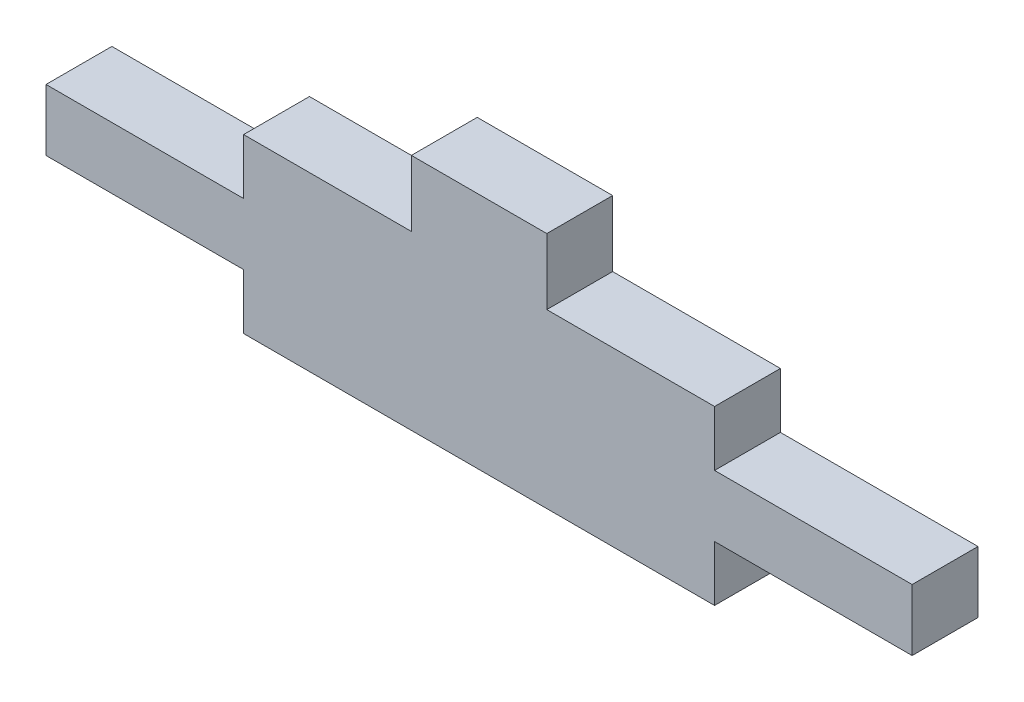
ISO-10303-21;
HEADER;
FILE_DESCRIPTION(('STEP AP214'),'2;1');
FILE_NAME('part.step','',(''),(''),'','','');
FILE_SCHEMA(('AUTOMOTIVE_DESIGN { 1 0 10303 214 1 1 1 1 }'));
ENDSEC;
DATA;
#1=APPLICATION_CONTEXT('core data for automotive mechanical design processes');
#2=APPLICATION_PROTOCOL_DEFINITION('international standard','automotive_design',2000,#1);
#3=PRODUCT_CONTEXT('',#1,'mechanical');
#4=PRODUCT('Part','Part','',(#3));
#5=PRODUCT_RELATED_PRODUCT_CATEGORY('part','',(#4));
#6=PRODUCT_DEFINITION_FORMATION('','',#4);
#7=PRODUCT_DEFINITION_CONTEXT('part definition',#1,'design');
#8=PRODUCT_DEFINITION('design','',#6,#7);
#9=PRODUCT_DEFINITION_SHAPE('','',#8);
#10=(LENGTH_UNIT() NAMED_UNIT(*) SI_UNIT(.MILLI.,.METRE.));
#11=(NAMED_UNIT(*) PLANE_ANGLE_UNIT() SI_UNIT($,.RADIAN.));
#12=(NAMED_UNIT(*) SI_UNIT($,.STERADIAN.) SOLID_ANGLE_UNIT());
#13=UNCERTAINTY_MEASURE_WITH_UNIT(LENGTH_MEASURE(1.E-05),#10,'distance_accuracy_value','');
#14=(GEOMETRIC_REPRESENTATION_CONTEXT(3) GLOBAL_UNCERTAINTY_ASSIGNED_CONTEXT((#13)) GLOBAL_UNIT_ASSIGNED_CONTEXT((#10,
#11,#12)) REPRESENTATION_CONTEXT('',''));
#15=CARTESIAN_POINT('',(0.,0.,0.));
#16=DIRECTION('',(0.,0.,1.));
#17=DIRECTION('',(1.,0.,0.));
#18=AXIS2_PLACEMENT_3D('',#15,#16,#17);
#19=CARTESIAN_POINT('',(40.6800004420004,19.3499997259001,5.35));
#20=DIRECTION('',(0.,-1.,0.));
#21=DIRECTION('',(0.,0.,-1.));
#22=AXIS2_PLACEMENT_3D('',#19,#20,#21);
#23=PLANE('',#22);
#24=DIRECTION('',(-1.,0.,0.));
#25=VECTOR('',#24,1.);
#26=CARTESIAN_POINT('',(40.6800004420004,19.3499997259001,0.));
#27=LINE('',#26,#25);
#28=CARTESIAN_POINT('',(40.6800004420004,19.3499997259001,0.));
#29=VERTEX_POINT('',#28);
#30=CARTESIAN_POINT('',(29.6800006181003,19.3499997259001,0.));
#31=VERTEX_POINT('',#30);
#32=EDGE_CURVE('E177',#29,#31,#27,.T.);
#33=ORIENTED_EDGE('',*,*,#32,.T.);
#34=DIRECTION('',(0.,0.,-1.));
#35=VECTOR('',#34,1.);
#36=CARTESIAN_POINT('',(29.6800006181003,19.3499997259001,5.35));
#37=LINE('',#36,#35);
#38=CARTESIAN_POINT('',(29.6800006181003,19.3499997259001,5.35));
#39=VERTEX_POINT('',#38);
#40=EDGE_CURVE('E11',#39,#31,#37,.T.);
#41=ORIENTED_EDGE('',*,*,#40,.F.);
#42=DIRECTION('',(-1.,0.,0.));
#43=VECTOR('',#42,1.);
#44=CARTESIAN_POINT('',(40.6800004420004,19.3499997259001,5.35));
#45=LINE('',#44,#43);
#46=CARTESIAN_POINT('',(40.6800004420004,19.3499997259001,5.35));
#47=VERTEX_POINT('',#46);
#48=EDGE_CURVE('E207',#47,#39,#45,.T.);
#49=ORIENTED_EDGE('',*,*,#48,.F.);
#50=DIRECTION('',(0.,0.,-1.));
#51=VECTOR('',#50,1.);
#52=CARTESIAN_POINT('',(40.6800004420004,19.3499997259001,5.35));
#53=LINE('',#52,#51);
#54=EDGE_CURVE('E173',#47,#29,#53,.T.);
#55=ORIENTED_EDGE('',*,*,#54,.T.);
#56=EDGE_LOOP('',(#33,#41,#49,#55));
#57=FACE_BOUND('',#56,.T.);
#58=ADVANCED_FACE('F33',(#57),#23,.F.);
#59=CARTESIAN_POINT('',(29.6800006181003,19.3499997259001,5.35));
#60=DIRECTION('',(1.,0.,0.));
#61=DIRECTION('',(0.,0.,-1.));
#62=AXIS2_PLACEMENT_3D('',#59,#60,#61);
#63=PLANE('',#62);
#64=DIRECTION('',(0.,-1.,0.));
#65=VECTOR('',#64,1.);
#66=CARTESIAN_POINT('',(29.6800006181003,19.3499997259001,0.));
#67=LINE('',#66,#65);
#68=CARTESIAN_POINT('',(29.6800006181003,14.0000004321996,0.));
#69=VERTEX_POINT('',#68);
#70=EDGE_CURVE('E180',#31,#69,#67,.T.);
#71=ORIENTED_EDGE('',*,*,#70,.T.);
#72=DIRECTION('',(0.,0.,-1.));
#73=VECTOR('',#72,1.);
#74=CARTESIAN_POINT('',(29.6800006181003,14.0000004321996,5.35));
#75=LINE('',#74,#73);
#76=CARTESIAN_POINT('',(29.6800006181003,14.0000004321996,5.35));
#77=VERTEX_POINT('',#76);
#78=EDGE_CURVE('E41',#77,#69,#75,.T.);
#79=ORIENTED_EDGE('',*,*,#78,.F.);
#80=DIRECTION('',(0.,-1.,0.));
#81=VECTOR('',#80,1.);
#82=CARTESIAN_POINT('',(29.6800006181003,19.3499997259001,5.35));
#83=LINE('',#82,#81);
#84=EDGE_CURVE('E116',#39,#77,#83,.T.);
#85=ORIENTED_EDGE('',*,*,#84,.F.);
#86=ORIENTED_EDGE('',*,*,#40,.T.);
#87=EDGE_LOOP('',(#71,#79,#85,#86));
#88=FACE_BOUND('',#87,.T.);
#89=ADVANCED_FACE('F305',(#88),#63,.F.);
#90=CARTESIAN_POINT('',(29.6800006181003,14.0000004321996,5.35));
#91=DIRECTION('',(0.,-1.,0.));
#92=DIRECTION('',(0.,0.,-1.));
#93=AXIS2_PLACEMENT_3D('',#90,#91,#92);
#94=PLANE('',#93);
#95=DIRECTION('',(-1.,0.,0.));
#96=VECTOR('',#95,1.);
#97=CARTESIAN_POINT('',(29.6800006181003,14.0000004321996,0.));
#98=LINE('',#97,#96);
#99=CARTESIAN_POINT('',(16.0499997437003,14.0000004321996,0.));
#100=VERTEX_POINT('',#99);
#101=EDGE_CURVE('E182',#69,#100,#98,.T.);
#102=ORIENTED_EDGE('',*,*,#101,.T.);
#103=DIRECTION('',(0.,0.,-1.));
#104=VECTOR('',#103,1.);
#105=CARTESIAN_POINT('',(16.0499997437003,14.0000004321996,5.35));
#106=LINE('',#105,#104);
#107=CARTESIAN_POINT('',(16.0499997437003,14.0000004321996,5.35));
#108=VERTEX_POINT('',#107);
#109=EDGE_CURVE('E238',#108,#100,#106,.T.);
#110=ORIENTED_EDGE('',*,*,#109,.F.);
#111=DIRECTION('',(-1.,0.,0.));
#112=VECTOR('',#111,1.);
#113=CARTESIAN_POINT('',(29.6800006181003,14.0000004321996,5.35));
#114=LINE('',#113,#112);
#115=EDGE_CURVE('E246',#77,#108,#114,.T.);
#116=ORIENTED_EDGE('',*,*,#115,.F.);
#117=ORIENTED_EDGE('',*,*,#78,.T.);
#118=EDGE_LOOP('',(#102,#110,#116,#117));
#119=FACE_BOUND('',#118,.T.);
#120=ADVANCED_FACE('F244',(#119),#94,.F.);
#121=CARTESIAN_POINT('',(16.0499997437003,14.0000004321996,5.35));
#122=DIRECTION('',(1.,0.,0.));
#123=DIRECTION('',(0.,0.,-1.));
#124=AXIS2_PLACEMENT_3D('',#121,#122,#123);
#125=PLANE('',#124);
#126=DIRECTION('',(0.,-1.,0.));
#127=VECTOR('',#126,1.);
#128=CARTESIAN_POINT('',(16.0499997437003,14.0000004321996,0.));
#129=LINE('',#128,#127);
#130=CARTESIAN_POINT('',(16.0499997437003,9.49999969459994,0.));
#131=VERTEX_POINT('',#130);
#132=EDGE_CURVE('E184',#100,#131,#129,.T.);
#133=ORIENTED_EDGE('',*,*,#132,.T.);
#134=DIRECTION('',(0.,0.,-1.));
#135=VECTOR('',#134,1.);
#136=CARTESIAN_POINT('',(16.0499997437003,9.49999969459994,5.35));
#137=LINE('',#136,#135);
#138=CARTESIAN_POINT('',(16.0499997437003,9.49999969459994,5.35));
#139=VERTEX_POINT('',#138);
#140=EDGE_CURVE('E235',#139,#131,#137,.T.);
#141=ORIENTED_EDGE('',*,*,#140,.F.);
#142=DIRECTION('',(0.,-1.,0.));
#143=VECTOR('',#142,1.);
#144=CARTESIAN_POINT('',(16.0499997437003,14.0000004321996,5.35));
#145=LINE('',#144,#143);
#146=EDGE_CURVE('E264',#108,#139,#145,.T.);
#147=ORIENTED_EDGE('',*,*,#146,.F.);
#148=ORIENTED_EDGE('',*,*,#109,.T.);
#149=EDGE_LOOP('',(#133,#141,#147,#148));
#150=FACE_BOUND('',#149,.T.);
#151=ADVANCED_FACE('F255',(#150),#125,.F.);
#152=CARTESIAN_POINT('',(16.0499997437003,9.49999969459994,5.35));
#153=DIRECTION('',(0.,-1.,0.));
#154=DIRECTION('',(0.,0.,-1.));
#155=AXIS2_PLACEMENT_3D('',#152,#153,#154);
#156=PLANE('',#155);
#157=DIRECTION('',(-1.,0.,0.));
#158=VECTOR('',#157,1.);
#159=CARTESIAN_POINT('',(16.0499997437003,9.49999969459994,0.));
#160=LINE('',#159,#158);
#161=CARTESIAN_POINT('',(0.,9.49999969459994,0.));
#162=VERTEX_POINT('',#161);
#163=EDGE_CURVE('E186',#131,#162,#160,.T.);
#164=ORIENTED_EDGE('',*,*,#163,.T.);
#165=DIRECTION('',(0.,0.,-1.));
#166=VECTOR('',#165,1.);
#167=CARTESIAN_POINT('',(0.,9.49999969459994,5.35));
#168=LINE('',#167,#166);
#169=CARTESIAN_POINT('',(0.,9.49999969459994,5.35));
#170=VERTEX_POINT('',#169);
#171=EDGE_CURVE('E232',#170,#162,#168,.T.);
#172=ORIENTED_EDGE('',*,*,#171,.F.);
#173=DIRECTION('',(-1.,0.,0.));
#174=VECTOR('',#173,1.);
#175=CARTESIAN_POINT('',(16.0499997437003,9.49999969459994,5.35));
#176=LINE('',#175,#174);
#177=EDGE_CURVE('E261',#139,#170,#176,.T.);
#178=ORIENTED_EDGE('',*,*,#177,.F.);
#179=ORIENTED_EDGE('',*,*,#140,.T.);
#180=EDGE_LOOP('',(#164,#172,#178,#179));
#181=FACE_BOUND('',#180,.T.);
#182=ADVANCED_FACE('F259',(#181),#156,.F.);
#183=CARTESIAN_POINT('',(0.,9.49999969459994,5.35));
#184=DIRECTION('',(1.,0.,0.));
#185=DIRECTION('',(0.,0.,-1.));
#186=AXIS2_PLACEMENT_3D('',#183,#184,#185);
#187=PLANE('',#186);
#188=DIRECTION('',(0.,-1.,0.));
#189=VECTOR('',#188,1.);
#190=CARTESIAN_POINT('',(0.,9.49999969459994,0.));
#191=LINE('',#190,#189);
#192=CARTESIAN_POINT('',(0.,4.49999980629984,0.));
#193=VERTEX_POINT('',#192);
#194=EDGE_CURVE('E188',#162,#193,#191,.T.);
#195=ORIENTED_EDGE('',*,*,#194,.T.);
#196=DIRECTION('',(0.,0.,-1.));
#197=VECTOR('',#196,1.);
#198=CARTESIAN_POINT('',(0.,4.49999980629984,5.35));
#199=LINE('',#198,#197);
#200=CARTESIAN_POINT('',(0.,4.49999980629984,5.35));
#201=VERTEX_POINT('',#200);
#202=EDGE_CURVE('E229',#201,#193,#199,.T.);
#203=ORIENTED_EDGE('',*,*,#202,.F.);
#204=DIRECTION('',(0.,-1.,0.));
#205=VECTOR('',#204,1.);
#206=CARTESIAN_POINT('',(0.,9.49999969459994,5.35));
#207=LINE('',#206,#205);
#208=EDGE_CURVE('E263',#170,#201,#207,.T.);
#209=ORIENTED_EDGE('',*,*,#208,.F.);
#210=ORIENTED_EDGE('',*,*,#171,.T.);
#211=EDGE_LOOP('',(#195,#203,#209,#210));
#212=FACE_BOUND('',#211,.T.);
#213=ADVANCED_FACE('F318',(#212),#187,.F.);
#214=CARTESIAN_POINT('',(0.,4.49999980629984,5.35));
#215=DIRECTION('',(0.,1.,0.));
#216=DIRECTION('',(0.,0.,1.));
#217=AXIS2_PLACEMENT_3D('',#214,#215,#216);
#218=PLANE('',#217);
#219=DIRECTION('',(1.,0.,0.));
#220=VECTOR('',#219,1.);
#221=CARTESIAN_POINT('',(0.,4.49999980629984,0.));
#222=LINE('',#221,#220);
#223=CARTESIAN_POINT('',(16.0499997437,4.49999980629984,0.));
#224=VERTEX_POINT('',#223);
#225=EDGE_CURVE('E190',#193,#224,#222,.T.);
#226=ORIENTED_EDGE('',*,*,#225,.T.);
#227=DIRECTION('',(0.,0.,-1.));
#228=VECTOR('',#227,1.);
#229=CARTESIAN_POINT('',(16.0499997437,4.49999980629984,5.35));
#230=LINE('',#229,#228);
#231=CARTESIAN_POINT('',(16.0499997437,4.49999980629984,5.35));
#232=VERTEX_POINT('',#231);
#233=EDGE_CURVE('E226',#232,#224,#230,.T.);
#234=ORIENTED_EDGE('',*,*,#233,.F.);
#235=DIRECTION('',(1.,0.,0.));
#236=VECTOR('',#235,1.);
#237=CARTESIAN_POINT('',(0.,4.49999980629984,5.35));
#238=LINE('',#237,#236);
#239=EDGE_CURVE('E266',#201,#232,#238,.T.);
#240=ORIENTED_EDGE('',*,*,#239,.F.);
#241=ORIENTED_EDGE('',*,*,#202,.T.);
#242=EDGE_LOOP('',(#226,#234,#240,#241));
#243=FACE_BOUND('',#242,.T.);
#244=ADVANCED_FACE('F321',(#243),#218,.F.);
#245=CARTESIAN_POINT('',(16.0499997437,4.49999980629984,5.35));
#246=DIRECTION('',(1.,0.,0.));
#247=DIRECTION('',(0.,0.,-1.));
#248=AXIS2_PLACEMENT_3D('',#245,#246,#247);
#249=PLANE('',#248);
#250=DIRECTION('',(0.,-1.,0.));
#251=VECTOR('',#250,1.);
#252=CARTESIAN_POINT('',(16.0499997437,4.49999980629984,0.));
#253=LINE('',#252,#251);
#254=CARTESIAN_POINT('',(16.0499997437,0.,0.));
#255=VERTEX_POINT('',#254);
#256=EDGE_CURVE('E192',#224,#255,#253,.T.);
#257=ORIENTED_EDGE('',*,*,#256,.T.);
#258=DIRECTION('',(0.,0.,-1.));
#259=VECTOR('',#258,1.);
#260=CARTESIAN_POINT('',(16.0499997437,0.,5.35));
#261=LINE('',#260,#259);
#262=CARTESIAN_POINT('',(16.0499997437,0.,5.35));
#263=VERTEX_POINT('',#262);
#264=EDGE_CURVE('E223',#263,#255,#261,.T.);
#265=ORIENTED_EDGE('',*,*,#264,.F.);
#266=DIRECTION('',(0.,-1.,0.));
#267=VECTOR('',#266,1.);
#268=CARTESIAN_POINT('',(16.0499997437,4.49999980629984,5.35));
#269=LINE('',#268,#267);
#270=EDGE_CURVE('E272',#232,#263,#269,.T.);
#271=ORIENTED_EDGE('',*,*,#270,.F.);
#272=ORIENTED_EDGE('',*,*,#233,.T.);
#273=EDGE_LOOP('',(#257,#265,#271,#272));
#274=FACE_BOUND('',#273,.T.);
#275=ADVANCED_FACE('F325',(#274),#249,.F.);
#276=CARTESIAN_POINT('',(16.0499997437,0.,5.35));
#277=DIRECTION('',(0.,1.,0.));
#278=DIRECTION('',(0.,0.,1.));
#279=AXIS2_PLACEMENT_3D('',#276,#277,#278);
#280=PLANE('',#279);
#281=DIRECTION('',(1.,0.,0.));
#282=VECTOR('',#281,1.);
#283=CARTESIAN_POINT('',(16.0499997437,0.,0.));
#284=LINE('',#283,#282);
#285=CARTESIAN_POINT('',(54.3100005015004,0.,0.));
#286=VERTEX_POINT('',#285);
#287=EDGE_CURVE('E194',#255,#286,#284,.T.);
#288=ORIENTED_EDGE('',*,*,#287,.T.);
#289=DIRECTION('',(0.,0.,-1.));
#290=VECTOR('',#289,1.);
#291=CARTESIAN_POINT('',(54.3100005015004,0.,5.35));
#292=LINE('',#291,#290);
#293=CARTESIAN_POINT('',(54.3100005015004,0.,5.35));
#294=VERTEX_POINT('',#293);
#295=EDGE_CURVE('E220',#294,#286,#292,.T.);
#296=ORIENTED_EDGE('',*,*,#295,.F.);
#297=DIRECTION('',(1.,0.,0.));
#298=VECTOR('',#297,1.);
#299=CARTESIAN_POINT('',(16.0499997437,0.,5.35));
#300=LINE('',#299,#298);
#301=EDGE_CURVE('E274',#263,#294,#300,.T.);
#302=ORIENTED_EDGE('',*,*,#301,.F.);
#303=ORIENTED_EDGE('',*,*,#264,.T.);
#304=EDGE_LOOP('',(#288,#296,#302,#303));
#305=FACE_BOUND('',#304,.T.);
#306=ADVANCED_FACE('F329',(#305),#280,.F.);
#307=CARTESIAN_POINT('',(54.3100005015004,0.,5.35));
#308=DIRECTION('',(-1.,0.,0.));
#309=DIRECTION('',(0.,0.,1.));
#310=AXIS2_PLACEMENT_3D('',#307,#308,#309);
#311=PLANE('',#310);
#312=DIRECTION('',(0.,1.,0.));
#313=VECTOR('',#312,1.);
#314=CARTESIAN_POINT('',(54.3100005015004,0.,0.));
#315=LINE('',#314,#313);
#316=CARTESIAN_POINT('',(54.3100005015004,4.49999980630031,0.));
#317=VERTEX_POINT('',#316);
#318=EDGE_CURVE('E196',#286,#317,#315,.T.);
#319=ORIENTED_EDGE('',*,*,#318,.T.);
#320=DIRECTION('',(0.,0.,-1.));
#321=VECTOR('',#320,1.);
#322=CARTESIAN_POINT('',(54.3100005015004,4.49999980630031,5.35));
#323=LINE('',#322,#321);
#324=CARTESIAN_POINT('',(54.3100005015004,4.49999980630031,5.35));
#325=VERTEX_POINT('',#324);
#326=EDGE_CURVE('E217',#325,#317,#323,.T.);
#327=ORIENTED_EDGE('',*,*,#326,.F.);
#328=DIRECTION('',(0.,1.,0.));
#329=VECTOR('',#328,1.);
#330=CARTESIAN_POINT('',(54.3100005015004,0.,5.35));
#331=LINE('',#330,#329);
#332=EDGE_CURVE('E276',#294,#325,#331,.T.);
#333=ORIENTED_EDGE('',*,*,#332,.F.);
#334=ORIENTED_EDGE('',*,*,#295,.T.);
#335=EDGE_LOOP('',(#319,#327,#333,#334));
#336=FACE_BOUND('',#335,.T.);
#337=ADVANCED_FACE('F333',(#336),#311,.F.);
#338=CARTESIAN_POINT('',(54.3100005015004,4.49999980630031,5.35));
#339=DIRECTION('',(0.,1.,0.));
#340=DIRECTION('',(0.,0.,1.));
#341=AXIS2_PLACEMENT_3D('',#338,#339,#340);
#342=PLANE('',#341);
#343=DIRECTION('',(1.,0.,0.));
#344=VECTOR('',#343,1.);
#345=CARTESIAN_POINT('',(54.3100005015004,4.49999980630031,0.));
#346=LINE('',#345,#344);
#347=CARTESIAN_POINT('',(70.3600011765999,4.49999980630031,0.));
#348=VERTEX_POINT('',#347);
#349=EDGE_CURVE('E198',#317,#348,#346,.T.);
#350=ORIENTED_EDGE('',*,*,#349,.T.);
#351=DIRECTION('',(0.,0.,-1.));
#352=VECTOR('',#351,1.);
#353=CARTESIAN_POINT('',(70.3600011765999,4.49999980630031,5.35));
#354=LINE('',#353,#352);
#355=CARTESIAN_POINT('',(70.3600011765999,4.49999980630031,5.35));
#356=VERTEX_POINT('',#355);
#357=EDGE_CURVE('E214',#356,#348,#354,.T.);
#358=ORIENTED_EDGE('',*,*,#357,.F.);
#359=DIRECTION('',(1.,0.,0.));
#360=VECTOR('',#359,1.);
#361=CARTESIAN_POINT('',(54.3100005015004,4.49999980630031,5.35));
#362=LINE('',#361,#360);
#363=EDGE_CURVE('E278',#325,#356,#362,.T.);
#364=ORIENTED_EDGE('',*,*,#363,.F.);
#365=ORIENTED_EDGE('',*,*,#326,.T.);
#366=EDGE_LOOP('',(#350,#358,#364,#365));
#367=FACE_BOUND('',#366,.T.);
#368=ADVANCED_FACE('F337',(#367),#342,.F.);
#369=CARTESIAN_POINT('',(70.3600011765999,4.49999980630031,5.35));
#370=DIRECTION('',(-1.,0.,0.));
#371=DIRECTION('',(0.,0.,1.));
#372=AXIS2_PLACEMENT_3D('',#369,#370,#371);
#373=PLANE('',#372);
#374=DIRECTION('',(0.,1.,0.));
#375=VECTOR('',#374,1.);
#376=CARTESIAN_POINT('',(70.3600011765999,4.49999980630031,0.));
#377=LINE('',#376,#375);
#378=CARTESIAN_POINT('',(70.3600011765999,9.49999969460044,0.));
#379=VERTEX_POINT('',#378);
#380=EDGE_CURVE('E200',#348,#379,#377,.T.);
#381=ORIENTED_EDGE('',*,*,#380,.T.);
#382=DIRECTION('',(0.,0.,-1.));
#383=VECTOR('',#382,1.);
#384=CARTESIAN_POINT('',(70.3600011765999,9.49999969460044,5.35));
#385=LINE('',#384,#383);
#386=CARTESIAN_POINT('',(70.3600011765999,9.49999969460044,5.35));
#387=VERTEX_POINT('',#386);
#388=EDGE_CURVE('E211',#387,#379,#385,.T.);
#389=ORIENTED_EDGE('',*,*,#388,.F.);
#390=DIRECTION('',(0.,1.,0.));
#391=VECTOR('',#390,1.);
#392=CARTESIAN_POINT('',(70.3600011765999,4.49999980630031,5.35));
#393=LINE('',#392,#391);
#394=EDGE_CURVE('E280',#356,#387,#393,.T.);
#395=ORIENTED_EDGE('',*,*,#394,.F.);
#396=ORIENTED_EDGE('',*,*,#357,.T.);
#397=EDGE_LOOP('',(#381,#389,#395,#396));
#398=FACE_BOUND('',#397,.T.);
#399=ADVANCED_FACE('F286',(#398),#373,.F.);
#400=CARTESIAN_POINT('',(70.3600011765999,9.49999969460044,5.35));
#401=DIRECTION('',(0.,-1.,0.));
#402=DIRECTION('',(0.,0.,-1.));
#403=AXIS2_PLACEMENT_3D('',#400,#401,#402);
#404=PLANE('',#403);
#405=DIRECTION('',(-1.,0.,0.));
#406=VECTOR('',#405,1.);
#407=CARTESIAN_POINT('',(70.3600011765999,9.49999969460044,0.));
#408=LINE('',#407,#406);
#409=CARTESIAN_POINT('',(54.3100005014999,9.49999969460044,0.));
#410=VERTEX_POINT('',#409);
#411=EDGE_CURVE('E202',#379,#410,#408,.T.);
#412=ORIENTED_EDGE('',*,*,#411,.T.);
#413=DIRECTION('',(0.,0.,-1.));
#414=VECTOR('',#413,1.);
#415=CARTESIAN_POINT('',(54.3100005014999,9.49999969460044,5.35));
#416=LINE('',#415,#414);
#417=CARTESIAN_POINT('',(54.3100005014999,9.49999969460044,5.35));
#418=VERTEX_POINT('',#417);
#419=EDGE_CURVE('E168',#418,#410,#416,.T.);
#420=ORIENTED_EDGE('',*,*,#419,.F.);
#421=DIRECTION('',(-1.,0.,0.));
#422=VECTOR('',#421,1.);
#423=CARTESIAN_POINT('',(70.3600011765999,9.49999969460044,5.35));
#424=LINE('',#423,#422);
#425=EDGE_CURVE('E159',#387,#418,#424,.T.);
#426=ORIENTED_EDGE('',*,*,#425,.F.);
#427=ORIENTED_EDGE('',*,*,#388,.T.);
#428=EDGE_LOOP('',(#412,#420,#426,#427));
#429=FACE_BOUND('',#428,.T.);
#430=ADVANCED_FACE('F290',(#429),#404,.F.);
#431=CARTESIAN_POINT('',(54.3100005014999,9.49999969460044,5.35));
#432=DIRECTION('',(-1.,0.,0.));
#433=DIRECTION('',(0.,0.,1.));
#434=AXIS2_PLACEMENT_3D('',#431,#432,#433);
#435=PLANE('',#434);
#436=DIRECTION('',(0.,1.,0.));
#437=VECTOR('',#436,1.);
#438=CARTESIAN_POINT('',(54.3100005014999,9.49999969460044,0.));
#439=LINE('',#438,#437);
#440=CARTESIAN_POINT('',(54.3100005014999,14.0000004322004,0.));
#441=VERTEX_POINT('',#440);
#442=EDGE_CURVE('E167',#410,#441,#439,.T.);
#443=ORIENTED_EDGE('',*,*,#442,.T.);
#444=DIRECTION('',(0.,0.,-1.));
#445=VECTOR('',#444,1.);
#446=CARTESIAN_POINT('',(54.3100005014999,14.0000004322004,5.35));
#447=LINE('',#446,#445);
#448=CARTESIAN_POINT('',(54.3100005014999,14.0000004322004,5.35));
#449=VERTEX_POINT('',#448);
#450=EDGE_CURVE('E164',#449,#441,#447,.T.);
#451=ORIENTED_EDGE('',*,*,#450,.F.);
#452=DIRECTION('',(0.,1.,0.));
#453=VECTOR('',#452,1.);
#454=CARTESIAN_POINT('',(54.3100005014999,9.49999969460044,5.35));
#455=LINE('',#454,#453);
#456=EDGE_CURVE('E153',#418,#449,#455,.T.);
#457=ORIENTED_EDGE('',*,*,#456,.F.);
#458=ORIENTED_EDGE('',*,*,#419,.T.);
#459=EDGE_LOOP('',(#443,#451,#457,#458));
#460=FACE_BOUND('',#459,.T.);
#461=ADVANCED_FACE('F165',(#460),#435,.F.);
#462=CARTESIAN_POINT('',(54.3100005014999,14.0000004322004,5.35));
#463=DIRECTION('',(0.,-1.,0.));
#464=DIRECTION('',(0.,0.,-1.));
#465=AXIS2_PLACEMENT_3D('',#462,#463,#464);
#466=PLANE('',#465);
#467=DIRECTION('',(-1.,0.,0.));
#468=VECTOR('',#467,1.);
#469=CARTESIAN_POINT('',(54.3100005014999,14.0000004322004,0.));
#470=LINE('',#469,#468);
#471=CARTESIAN_POINT('',(40.6800004420004,14.0000004322004,0.));
#472=VERTEX_POINT('',#471);
#473=EDGE_CURVE('E102',#441,#472,#470,.T.);
#474=ORIENTED_EDGE('',*,*,#473,.T.);
#475=DIRECTION('',(0.,0.,-1.));
#476=VECTOR('',#475,1.);
#477=CARTESIAN_POINT('',(40.6800004420004,14.0000004322004,5.35));
#478=LINE('',#477,#476);
#479=CARTESIAN_POINT('',(40.6800004420004,14.0000004322004,5.35));
#480=VERTEX_POINT('',#479);
#481=EDGE_CURVE('E169',#480,#472,#478,.T.);
#482=ORIENTED_EDGE('',*,*,#481,.F.);
#483=DIRECTION('',(-1.,0.,0.));
#484=VECTOR('',#483,1.);
#485=CARTESIAN_POINT('',(54.3100005014999,14.0000004322004,5.35));
#486=LINE('',#485,#484);
#487=EDGE_CURVE('E157',#449,#480,#486,.T.);
#488=ORIENTED_EDGE('',*,*,#487,.F.);
#489=ORIENTED_EDGE('',*,*,#450,.T.);
#490=EDGE_LOOP('',(#474,#482,#488,#489));
#491=FACE_BOUND('',#490,.T.);
#492=ADVANCED_FACE('F171',(#491),#466,.F.);
#493=CARTESIAN_POINT('',(40.6800004420004,14.0000004322004,5.35));
#494=DIRECTION('',(-1.,0.,0.));
#495=DIRECTION('',(0.,0.,1.));
#496=AXIS2_PLACEMENT_3D('',#493,#494,#495);
#497=PLANE('',#496);
#498=DIRECTION('',(0.,1.,0.));
#499=VECTOR('',#498,1.);
#500=CARTESIAN_POINT('',(40.6800004420004,14.0000004322004,0.));
#501=LINE('',#500,#499);
#502=EDGE_CURVE('E108',#472,#29,#501,.T.);
#503=ORIENTED_EDGE('',*,*,#502,.T.);
#504=ORIENTED_EDGE('',*,*,#54,.F.);
#505=DIRECTION('',(0.,1.,0.));
#506=VECTOR('',#505,1.);
#507=CARTESIAN_POINT('',(40.6800004420004,14.0000004322004,5.35));
#508=LINE('',#507,#506);
#509=EDGE_CURVE('E49',#480,#47,#508,.T.);
#510=ORIENTED_EDGE('',*,*,#509,.F.);
#511=ORIENTED_EDGE('',*,*,#481,.T.);
#512=EDGE_LOOP('',(#503,#504,#510,#511));
#513=FACE_BOUND('',#512,.T.);
#514=ADVANCED_FACE('F294',(#513),#497,.F.);
#515=CARTESIAN_POINT('',(0.,0.,5.35));
#516=DIRECTION('',(0.,0.,1.));
#517=DIRECTION('',(1.,0.,0.));
#518=AXIS2_PLACEMENT_3D('',#515,#516,#517);
#519=PLANE('',#518);
#520=ORIENTED_EDGE('',*,*,#48,.T.);
#521=ORIENTED_EDGE('',*,*,#84,.T.);
#522=ORIENTED_EDGE('',*,*,#115,.T.);
#523=ORIENTED_EDGE('',*,*,#146,.T.);
#524=ORIENTED_EDGE('',*,*,#177,.T.);
#525=ORIENTED_EDGE('',*,*,#208,.T.);
#526=ORIENTED_EDGE('',*,*,#239,.T.);
#527=ORIENTED_EDGE('',*,*,#270,.T.);
#528=ORIENTED_EDGE('',*,*,#301,.T.);
#529=ORIENTED_EDGE('',*,*,#332,.T.);
#530=ORIENTED_EDGE('',*,*,#363,.T.);
#531=ORIENTED_EDGE('',*,*,#394,.T.);
#532=ORIENTED_EDGE('',*,*,#425,.T.);
#533=ORIENTED_EDGE('',*,*,#456,.T.);
#534=ORIENTED_EDGE('',*,*,#487,.T.);
#535=ORIENTED_EDGE('',*,*,#509,.T.);
#536=EDGE_LOOP('',(#520,#521,#522,#523,#524,#525,#526,#527,#528,#529,#530,#531,#532,#533,#534,#535));
#537=FACE_BOUND('',#536,.T.);
#538=ADVANCED_FACE('F155',(#537),#519,.T.);
#539=CARTESIAN_POINT('',(0.,0.,0.));
#540=DIRECTION('',(0.,0.,1.));
#541=DIRECTION('',(1.,0.,0.));
#542=AXIS2_PLACEMENT_3D('',#539,#540,#541);
#543=PLANE('',#542);
#544=ORIENTED_EDGE('',*,*,#32,.F.);
#545=ORIENTED_EDGE('',*,*,#502,.F.);
#546=ORIENTED_EDGE('',*,*,#473,.F.);
#547=ORIENTED_EDGE('',*,*,#442,.F.);
#548=ORIENTED_EDGE('',*,*,#411,.F.);
#549=ORIENTED_EDGE('',*,*,#380,.F.);
#550=ORIENTED_EDGE('',*,*,#349,.F.);
#551=ORIENTED_EDGE('',*,*,#318,.F.);
#552=ORIENTED_EDGE('',*,*,#287,.F.);
#553=ORIENTED_EDGE('',*,*,#256,.F.);
#554=ORIENTED_EDGE('',*,*,#225,.F.);
#555=ORIENTED_EDGE('',*,*,#194,.F.);
#556=ORIENTED_EDGE('',*,*,#163,.F.);
#557=ORIENTED_EDGE('',*,*,#132,.F.);
#558=ORIENTED_EDGE('',*,*,#101,.F.);
#559=ORIENTED_EDGE('',*,*,#70,.F.);
#560=EDGE_LOOP('',(#544,#545,#546,#547,#548,#549,#550,#551,#552,#553,#554,#555,#556,#557,#558,#559));
#561=FACE_BOUND('',#560,.T.);
#562=ADVANCED_FACE('F250',(#561),#543,.F.);
#563=CLOSED_SHELL('',(#58,#89,#120,#151,#182,#213,#244,#275,#306,#337,#368,#399,#430,#461,#492,
#514,#538,#562));
#564=MANIFOLD_SOLID_BREP('B2',#563);
#565=ADVANCED_BREP_SHAPE_REPRESENTATION('',(#18,#564),#14);
#566=SHAPE_DEFINITION_REPRESENTATION(#9,#565);
ENDSEC;
END-ISO-10303-21;
